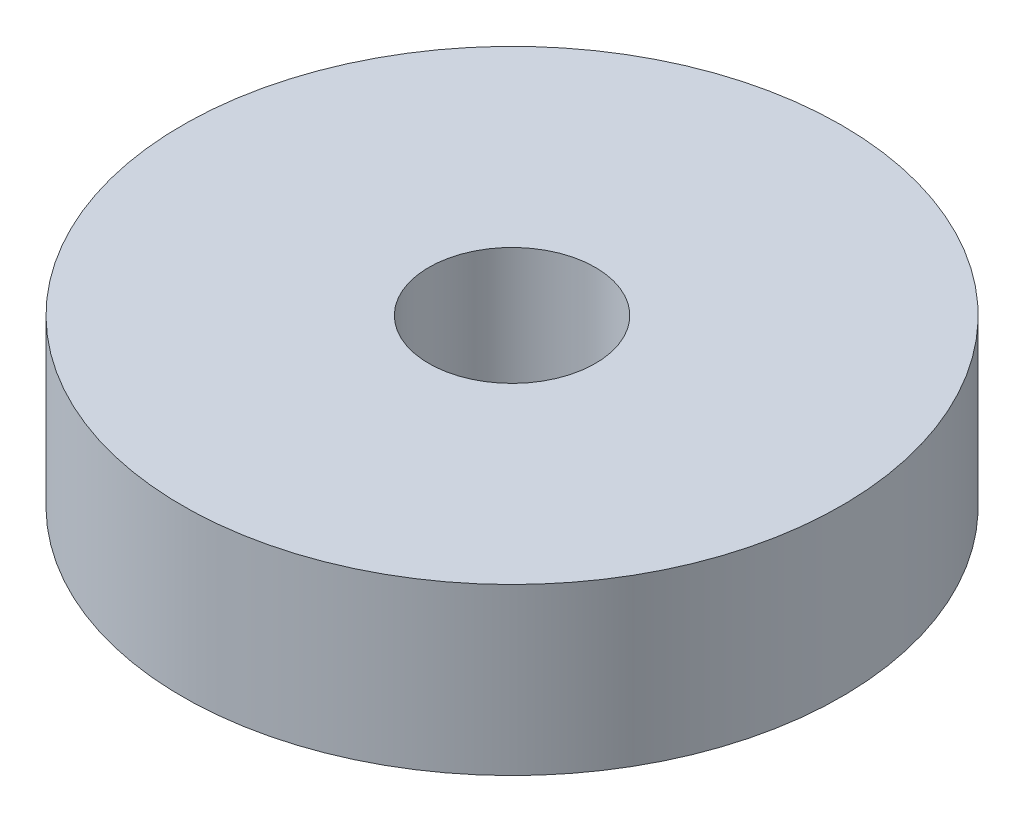
ISO-10303-21;
HEADER;
FILE_DESCRIPTION(('STEP AP214'),'2;1');
FILE_NAME('part.step','',(''),(''),'','','');
FILE_SCHEMA(('AUTOMOTIVE_DESIGN { 1 0 10303 214 1 1 1 1 }'));
ENDSEC;
DATA;
#1=APPLICATION_CONTEXT('core data for automotive mechanical design processes');
#2=APPLICATION_PROTOCOL_DEFINITION('international standard','automotive_design',2000,#1);
#3=PRODUCT_CONTEXT('',#1,'mechanical');
#4=PRODUCT('Part','Part','',(#3));
#5=PRODUCT_RELATED_PRODUCT_CATEGORY('part','',(#4));
#6=PRODUCT_DEFINITION_FORMATION('','',#4);
#7=PRODUCT_DEFINITION_CONTEXT('part definition',#1,'design');
#8=PRODUCT_DEFINITION('design','',#6,#7);
#9=PRODUCT_DEFINITION_SHAPE('','',#8);
#10=(LENGTH_UNIT() NAMED_UNIT(*) SI_UNIT(.MILLI.,.METRE.));
#11=(NAMED_UNIT(*) PLANE_ANGLE_UNIT() SI_UNIT($,.RADIAN.));
#12=(NAMED_UNIT(*) SI_UNIT($,.STERADIAN.) SOLID_ANGLE_UNIT());
#13=UNCERTAINTY_MEASURE_WITH_UNIT(LENGTH_MEASURE(1.E-05),#10,'distance_accuracy_value','');
#14=(GEOMETRIC_REPRESENTATION_CONTEXT(3) GLOBAL_UNCERTAINTY_ASSIGNED_CONTEXT((#13)) GLOBAL_UNIT_ASSIGNED_CONTEXT((#10,
#11,#12)) REPRESENTATION_CONTEXT('',''));
#15=CARTESIAN_POINT('',(0.,0.,0.));
#16=DIRECTION('',(0.,0.,1.));
#17=DIRECTION('',(1.,0.,0.));
#18=AXIS2_PLACEMENT_3D('',#15,#16,#17);
#19=CARTESIAN_POINT('',(0.,-100.,0.));
#20=DIRECTION('',(0.,-1.,0.));
#21=DIRECTION('',(0.,0.,-1.));
#22=AXIS2_PLACEMENT_3D('',#19,#20,#21);
#23=CYLINDRICAL_SURFACE('',#22,3.02);
#24=CARTESIAN_POINT('',(0.,58.5,0.));
#25=DIRECTION('',(0.,-1.,0.));
#26=DIRECTION('',(0.,0.,-1.));
#27=AXIS2_PLACEMENT_3D('',#24,#25,#26);
#28=CIRCLE('',#27,3.02);
#29=CARTESIAN_POINT('',(0.,58.5,-3.02));
#30=VERTEX_POINT('',#29);
#31=EDGE_CURVE('E10',#30,#30,#28,.T.);
#32=ORIENTED_EDGE('',*,*,#31,.T.);
#33=EDGE_LOOP('',(#32));
#34=FACE_BOUND('',#33,.T.);
#35=CARTESIAN_POINT('',(0.,64.5,0.));
#36=DIRECTION('',(0.,-1.,0.));
#37=DIRECTION('',(0.,0.,-1.));
#38=AXIS2_PLACEMENT_3D('',#35,#36,#37);
#39=CIRCLE('',#38,3.02);
#40=CARTESIAN_POINT('',(0.,64.5,-3.02));
#41=VERTEX_POINT('',#40);
#42=EDGE_CURVE('E52',#41,#41,#39,.T.);
#43=ORIENTED_EDGE('',*,*,#42,.F.);
#44=EDGE_LOOP('',(#43));
#45=FACE_BOUND('',#44,.T.);
#46=ADVANCED_FACE('F39',(#34,#45),#23,.F.);
#47=CARTESIAN_POINT('',(3.02,58.5,0.));
#48=DIRECTION('',(0.,-1.,0.));
#49=DIRECTION('',(0.,0.,-1.));
#50=AXIS2_PLACEMENT_3D('',#47,#48,#49);
#51=PLANE('',#50);
#52=CARTESIAN_POINT('',(0.,58.5,0.));
#53=DIRECTION('',(0.,-1.,0.));
#54=DIRECTION('',(0.,0.,-1.));
#55=AXIS2_PLACEMENT_3D('',#52,#53,#54);
#56=CIRCLE('',#55,11.95);
#57=CARTESIAN_POINT('',(0.,58.5,-11.95));
#58=VERTEX_POINT('',#57);
#59=EDGE_CURVE('E44',#58,#58,#56,.T.);
#60=ORIENTED_EDGE('',*,*,#59,.T.);
#61=EDGE_LOOP('',(#60));
#62=FACE_BOUND('',#61,.T.);
#63=ORIENTED_EDGE('',*,*,#31,.F.);
#64=EDGE_LOOP('',(#63));
#65=FACE_BOUND('',#64,.T.);
#66=ADVANCED_FACE('F63',(#62,#65),#51,.T.);
#67=CARTESIAN_POINT('',(0.,-100.,0.));
#68=DIRECTION('',(0.,-1.,0.));
#69=DIRECTION('',(0.,0.,-1.));
#70=AXIS2_PLACEMENT_3D('',#67,#68,#69);
#71=CYLINDRICAL_SURFACE('',#70,11.95);
#72=CARTESIAN_POINT('',(0.,64.5,0.));
#73=DIRECTION('',(0.,-1.,0.));
#74=DIRECTION('',(0.,0.,-1.));
#75=AXIS2_PLACEMENT_3D('',#72,#73,#74);
#76=CIRCLE('',#75,11.95);
#77=CARTESIAN_POINT('',(0.,64.5,-11.95));
#78=VERTEX_POINT('',#77);
#79=EDGE_CURVE('E47',#78,#78,#76,.T.);
#80=ORIENTED_EDGE('',*,*,#79,.T.);
#81=EDGE_LOOP('',(#80));
#82=FACE_BOUND('',#81,.T.);
#83=ORIENTED_EDGE('',*,*,#59,.F.);
#84=EDGE_LOOP('',(#83));
#85=FACE_BOUND('',#84,.T.);
#86=ADVANCED_FACE('F70',(#82,#85),#71,.T.);
#87=CARTESIAN_POINT('',(11.95,64.5,0.));
#88=DIRECTION('',(0.,1.,0.));
#89=DIRECTION('',(0.,0.,1.));
#90=AXIS2_PLACEMENT_3D('',#87,#88,#89);
#91=PLANE('',#90);
#92=ORIENTED_EDGE('',*,*,#42,.T.);
#93=EDGE_LOOP('',(#92));
#94=FACE_BOUND('',#93,.T.);
#95=ORIENTED_EDGE('',*,*,#79,.F.);
#96=EDGE_LOOP('',(#95));
#97=FACE_BOUND('',#96,.T.);
#98=ADVANCED_FACE('F56',(#94,#97),#91,.T.);
#99=CLOSED_SHELL('',(#46,#66,#86,#98));
#100=MANIFOLD_SOLID_BREP('B2',#99);
#101=ADVANCED_BREP_SHAPE_REPRESENTATION('',(#18,#100),#14);
#102=SHAPE_DEFINITION_REPRESENTATION(#9,#101);
ENDSEC;
END-ISO-10303-21;
